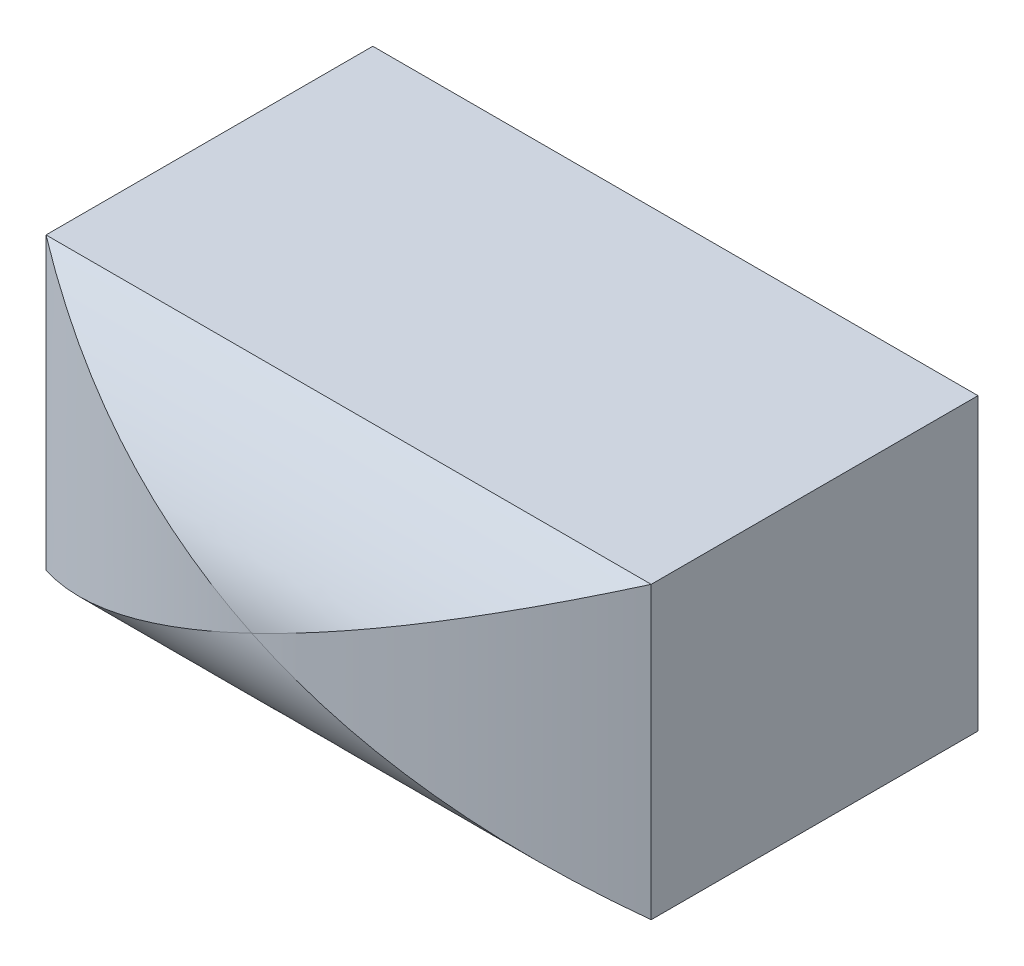
ISO-10303-21;
HEADER;
FILE_DESCRIPTION(('STEP AP214'),'2;1');
FILE_NAME('part.step','',(''),(''),'','','');
FILE_SCHEMA(('AUTOMOTIVE_DESIGN { 1 0 10303 214 1 1 1 1 }'));
ENDSEC;
DATA;
#1=APPLICATION_CONTEXT('core data for automotive mechanical design processes');
#2=APPLICATION_PROTOCOL_DEFINITION('international standard','automotive_design',2000,#1);
#3=PRODUCT_CONTEXT('',#1,'mechanical');
#4=PRODUCT('Part','Part','',(#3));
#5=PRODUCT_RELATED_PRODUCT_CATEGORY('part','',(#4));
#6=PRODUCT_DEFINITION_FORMATION('','',#4);
#7=PRODUCT_DEFINITION_CONTEXT('part definition',#1,'design');
#8=PRODUCT_DEFINITION('design','',#6,#7);
#9=PRODUCT_DEFINITION_SHAPE('','',#8);
#10=(LENGTH_UNIT() NAMED_UNIT(*) SI_UNIT(.MILLI.,.METRE.));
#11=(NAMED_UNIT(*) PLANE_ANGLE_UNIT() SI_UNIT($,.RADIAN.));
#12=(NAMED_UNIT(*) SI_UNIT($,.STERADIAN.) SOLID_ANGLE_UNIT());
#13=UNCERTAINTY_MEASURE_WITH_UNIT(LENGTH_MEASURE(1.E-05),#10,'distance_accuracy_value','');
#14=(GEOMETRIC_REPRESENTATION_CONTEXT(3) GLOBAL_UNCERTAINTY_ASSIGNED_CONTEXT((#13)) GLOBAL_UNIT_ASSIGNED_CONTEXT((#10,
#11,#12)) REPRESENTATION_CONTEXT('',''));
#15=CARTESIAN_POINT('',(0.,0.,0.));
#16=DIRECTION('',(0.,0.,1.));
#17=DIRECTION('',(1.,0.,0.));
#18=AXIS2_PLACEMENT_3D('',#15,#16,#17);
#19=CARTESIAN_POINT('',(-2500.,-1200.,3500.));
#20=DIRECTION('',(1.,0.,0.));
#21=DIRECTION('',(0.,0.,-1.));
#22=AXIS2_PLACEMENT_3D('',#19,#20,#21);
#23=PLANE('',#22);
#24=DIRECTION('',(0.,0.,-1.));
#25=VECTOR('',#24,1.);
#26=CARTESIAN_POINT('',(-2500.,250.,1000.));
#27=LINE('',#26,#25);
#28=CARTESIAN_POINT('',(-2500.,250.,1000.));
#29=VERTEX_POINT('',#28);
#30=CARTESIAN_POINT('',(-2500.,250.,0.));
#31=VERTEX_POINT('',#30);
#32=EDGE_CURVE('E108',#29,#31,#27,.T.);
#33=ORIENTED_EDGE('',*,*,#32,.F.);
#34=DIRECTION('',(0.,1.,0.));
#35=VECTOR('',#34,1.);
#36=CARTESIAN_POINT('',(-2500.,-250.,1000.));
#37=LINE('',#36,#35);
#38=CARTESIAN_POINT('',(-2500.,-250.,1000.));
#39=VERTEX_POINT('',#38);
#40=EDGE_CURVE('E297',#39,#29,#37,.T.);
#41=ORIENTED_EDGE('',*,*,#40,.F.);
#42=DIRECTION('',(0.,0.,1.));
#43=VECTOR('',#42,1.);
#44=CARTESIAN_POINT('',(-2500.,-250.,1000.));
#45=LINE('',#44,#43);
#46=CARTESIAN_POINT('',(-2500.,-250.,0.));
#47=VERTEX_POINT('',#46);
#48=EDGE_CURVE('E114',#47,#39,#45,.T.);
#49=ORIENTED_EDGE('',*,*,#48,.F.);
#50=DIRECTION('',(0.,-1.,0.));
#51=VECTOR('',#50,1.);
#52=CARTESIAN_POINT('',(-2500.,-1200.,0.));
#53=LINE('',#52,#51);
#54=CARTESIAN_POINT('',(-2500.,-1200.,0.));
#55=VERTEX_POINT('',#54);
#56=EDGE_CURVE('E183',#47,#55,#53,.T.);
#57=ORIENTED_EDGE('',*,*,#56,.T.);
#58=DIRECTION('',(0.,0.,-1.));
#59=VECTOR('',#58,1.);
#60=CARTESIAN_POINT('',(-2500.,-1200.,3500.));
#61=LINE('',#60,#59);
#62=CARTESIAN_POINT('',(-2500.,-1200.,2700.06844996732));
#63=VERTEX_POINT('',#62);
#64=EDGE_CURVE('E255',#63,#55,#61,.T.);
#65=ORIENTED_EDGE('',*,*,#64,.F.);
#66=DIRECTION('',(0.,-1.,0.));
#67=VECTOR('',#66,1.);
#68=CARTESIAN_POINT('',(-2500.,1200.,2700.06844996732));
#69=LINE('',#68,#67);
#70=CARTESIAN_POINT('',(-2500.,1200.,2700.06844996732));
#71=VERTEX_POINT('',#70);
#72=EDGE_CURVE('E236',#71,#63,#69,.T.);
#73=ORIENTED_EDGE('',*,*,#72,.F.);
#74=DIRECTION('',(0.,0.,-1.));
#75=VECTOR('',#74,1.);
#76=CARTESIAN_POINT('',(-2500.,1200.,3500.));
#77=LINE('',#76,#75);
#78=CARTESIAN_POINT('',(-2500.,1200.,0.));
#79=VERTEX_POINT('',#78);
#80=EDGE_CURVE('E258',#71,#79,#77,.T.);
#81=ORIENTED_EDGE('',*,*,#80,.T.);
#82=EDGE_CURVE('E248',#79,#31,#53,.T.);
#83=ORIENTED_EDGE('',*,*,#82,.T.);
#84=EDGE_LOOP('',(#33,#41,#49,#57,#65,#73,#81,#83));
#85=FACE_BOUND('',#84,.T.);
#86=ADVANCED_FACE('F88',(#85),#23,.F.);
#87=CARTESIAN_POINT('',(-2500.,1200.,2700.06844996732));
#88=CARTESIAN_POINT('',(-3.71772924945279E-13,1200.,4299.93155003268));
#89=CARTESIAN_POINT('',(2500.,1200.,2700.06844996732));
#90=B_SPLINE_CURVE_WITH_KNOTS('',2,(#87,#88,#89),.UNSPECIFIED.,.F.,.F.,(3,3),(0.,1.),.UNSPECIFIED.);
#91=DIRECTION('',(0.,-1.,0.));
#92=VECTOR('',#91,1.);
#93=SURFACE_OF_LINEAR_EXTRUSION('',#90,#92);
#94=DIRECTION('',(0.,-1.,0.));
#95=VECTOR('',#94,1.);
#96=CARTESIAN_POINT('',(2500.,1200.,2700.06844996732));
#97=LINE('',#96,#95);
#98=CARTESIAN_POINT('',(2500.,1200.,2700.06844996732));
#99=VERTEX_POINT('',#98);
#100=CARTESIAN_POINT('',(2500.,-1200.,2700.06844996732));
#101=VERTEX_POINT('',#100);
#102=EDGE_CURVE('E234',#99,#101,#97,.T.);
#103=ORIENTED_EDGE('',*,*,#102,.F.);
#104=CARTESIAN_POINT('',(2500.,1200.,2700.06844996732));
#105=CARTESIAN_POINT('',(2460.56025028869,1181.06892013857,2725.30768671132));
#106=CARTESIAN_POINT('',(2420.88678196818,1162.02565534473,2750.09931608531));
#107=CARTESIAN_POINT('',(2341.02225679549,1123.69068326183,2798.77508422432));
#108=CARTESIAN_POINT('',(2300.83058889641,1104.39868267028,2822.65798906947));
#109=CARTESIAN_POINT('',(2219.94587361914,1065.57401933719,2869.45905753302));
#110=CARTESIAN_POINT('',(2179.25239898305,1046.04115151186,2892.37631335845));
#111=CARTESIAN_POINT('',(2097.38126709024,1006.74300820332,2937.18972757122));
#112=CARTESIAN_POINT('',(2056.20334185353,986.977604089702,2959.0852839902));
#113=CARTESIAN_POINT('',(1973.38123503161,947.222992815165,3001.80031362612));
#114=CARTESIAN_POINT('',(1931.73691776256,927.233720526004,3022.61946324884));
#115=CARTESIAN_POINT('',(1847.99981217357,887.039909843338,3063.12854524513));
#116=CARTESIAN_POINT('',(1805.9069921269,866.835356220999,3082.81839709572));
#117=CARTESIAN_POINT('',(1742.37862969188,836.341742252148,3111.49782621573));
#118=CARTESIAN_POINT('',(1721.10437424075,826.130099635574,3120.92902942881));
#119=CARTESIAN_POINT('',(1678.44886386835,805.655454656796,3139.48867446687));
#120=CARTESIAN_POINT('',(1657.06760992977,795.392452766282,3148.61711906656));
#121=CARTESIAN_POINT('',(1614.20509525501,774.818445722409,3166.5630736677));
#122=CARTESIAN_POINT('',(1592.7238593266,764.507452476767,3175.38065658388));
#123=CARTESIAN_POINT('',(1549.65870386971,743.836177857461,3192.70105342289));
#124=CARTESIAN_POINT('',(1528.07478534472,733.475896965464,3201.20387041469));
#125=CARTESIAN_POINT('',(1484.81298381163,712.710232229585,3217.88630450437));
#126=CARTESIAN_POINT('',(1463.13513124964,702.304862999826,3226.06601873113));
#127=CARTESIAN_POINT('',(1419.68173282415,681.447231755593,3242.0989736794));
#128=CARTESIAN_POINT('',(1397.90618789139,670.994970187867,3249.95221750393));
#129=CARTESIAN_POINT('',(1354.26683831692,650.048082392119,3265.32405276632));
#130=CARTESIAN_POINT('',(1332.40306363201,639.553470543363,3272.84274882208));
#131=CARTESIAN_POINT('',(1288.583423337,618.52004320176,3287.54237837424));
#132=CARTESIAN_POINT('',(1266.62755779,607.981227739201,3294.72331210204));
#133=CARTESIAN_POINT('',(1222.63281204695,586.863749782535,3308.73991937875));
#134=CARTESIAN_POINT('',(1200.59395576911,576.285098769174,3315.57568527774));
#135=CARTESIAN_POINT('',(1156.43076907425,555.086769155643,3328.89854155923));
#136=CARTESIAN_POINT('',(1134.30643876904,544.46709060914,3335.38563239765));
#137=CARTESIAN_POINT('',(1089.97938953131,523.190106975028,3348.00482326991));
#138=CARTESIAN_POINT('',(1067.77668369325,512.532808172756,3354.13697987792));
#139=CARTESIAN_POINT('',(1023.29341061654,491.180837095936,3366.04221941037));
#140=CARTESIAN_POINT('',(1001.01284411046,480.48616517302,3371.81530570362));
#141=CARTESIAN_POINT('',(951.930107543995,456.926451621117,3384.11172994406));
#142=CARTESIAN_POINT('',(925.111664023731,444.053598731391,3390.55532339261));
#143=CARTESIAN_POINT('',(871.375387145461,418.260185829821,3402.91094325247));
#144=CARTESIAN_POINT('',(844.457553521576,405.339625690354,3408.8229682407));
#145=CARTESIAN_POINT('',(790.529999413454,379.454399718457,3420.10787502137));
#146=CARTESIAN_POINT('',(763.520278447679,366.489733654888,3425.48075398388));
#147=CARTESIAN_POINT('',(709.41662774717,340.51998131864,3435.68036613226));
#148=CARTESIAN_POINT('',(682.32269649506,327.514894317621,3440.50708941769));
#149=CARTESIAN_POINT('',(628.058375304537,301.468020146186,3449.6080059964));
#150=CARTESIAN_POINT('',(600.887982332276,288.426231519523,3453.88217704045));
#151=CARTESIAN_POINT('',(546.478587624964,262.309722059943,3461.87222890203));
#152=CARTESIAN_POINT('',(519.239581187722,249.234998969974,3465.58807033613));
#153=CARTESIAN_POINT('',(464.771565099833,223.090351248051,3472.44744433985));
#154=CARTESIAN_POINT('',(437.542698614802,210.020495335591,3475.59237526991));
#155=CARTESIAN_POINT('',(383.035812121849,183.857189818,3481.31697008191));
#156=CARTESIAN_POINT('',(355.75779056319,170.763739468516,3483.89661580404));
#157=CARTESIAN_POINT('',(301.164021414362,144.558730280702,3488.48678625096));
#158=CARTESIAN_POINT('',(273.848275482646,131.447172238429,3490.49733524149));
#159=CARTESIAN_POINT('',(219.190490841487,105.211435597149,3493.94641349789));
#160=CARTESIAN_POINT('',(191.848455432257,92.0872585822475,3495.38500702994));
#161=CARTESIAN_POINT('',(137.14973854871,65.8318745285988,3497.68823774718));
#162=CARTESIAN_POINT('',(109.79306057137,52.7006691683851,3498.55297760723));
#163=CARTESIAN_POINT('',(55.0761508846909,26.4365523305491,3499.70753240327));
#164=CARTESIAN_POINT('',(27.7159216754912,13.3036420530728,3499.99748771625));
#165=CARTESIAN_POINT('',(0.237582337864713,0.114039519131285,3499.99999458252));
#166=CARTESIAN_POINT('',(0.118791162275537,0.0570197563648097,3500.00000000082));
#167=CARTESIAN_POINT('',(0.,3.24019257594222E-13,3500.));
#168=B_SPLINE_CURVE_WITH_KNOTS('',3,(#104,#105,#106,#107,#108,#109,#110,#111,#112,#113,#114,
#115,#116,#117,#118,#119,#120,#121,#122,#123,#124,#125,#126,#127,#128,#129,#130,#131,#132,#133,
#134,#135,#136,#137,#138,#139,#140,#141,#142,#143,#144,#145,#146,#147,#148,#149,#150,#151,#152,
#153,#154,#155,#156,#157,#158,#159,#160,#161,#162,#163,#164,#165,#166,#167),.UNSPECIFIED.,.F.,
.F.,(4,2,2,2,2,2,2,2,2,2,2,2,2,2,2,2,2,2,2,2,2,2,2,2,2,2,2,2,2,2,2,4),(0.,151.517921385246,
303.234730449714,455.091121465279,607.035882323024,759.026059020843,911.027059724356,
987.264269507333,1063.50078039757,1139.71928888381,1215.93705404231,1292.13173002248,
1368.32568162451,1444.49563637735,1520.66553894433,1596.81495298496,1672.96426745079,
1749.10141060187,1825.23783932245,1916.54628641814,2007.8549779507,2099.16414872902,
2190.47497444887,2281.78947577255,2373.1104152154,2464.20456737941,2555.30164551973,
2646.39483878044,2737.47779371199,2828.54444753157,2919.58885781907,2919.98415943877),.UNSPECIFIED.);
#169=CARTESIAN_POINT('',(4.44089209850063E-13,-1.19149135002772E-09,3500.));
#170=VERTEX_POINT('',#169);
#171=EDGE_CURVE('E12',#99,#170,#168,.T.);
#172=ORIENTED_EDGE('',*,*,#171,.T.);
#173=CARTESIAN_POINT('',(2500.,-1200.,2700.06844996732));
#174=CARTESIAN_POINT('',(2460.56025028871,-1181.06892013858,2725.30768671131));
#175=CARTESIAN_POINT('',(2420.8867819682,-1162.02565534474,2750.0993160853));
#176=CARTESIAN_POINT('',(2341.02225679553,-1123.69068326185,2798.7750842243));
#177=CARTESIAN_POINT('',(2300.83058889647,-1104.3986826703,2822.65798906944));
#178=CARTESIAN_POINT('',(2219.94587361922,-1065.57401933722,2869.45905753297));
#179=CARTESIAN_POINT('',(2179.25239898313,-1046.0411515119,2892.37631335841));
#180=CARTESIAN_POINT('',(2097.38126709035,-1006.74300820337,2937.18972757117));
#181=CARTESIAN_POINT('',(2056.20334185365,-986.977604089756,2959.08528399014));
#182=CARTESIAN_POINT('',(1973.38123503174,-947.222992815228,3001.80031362606));
#183=CARTESIAN_POINT('',(1931.7369177627,-927.233720526072,3022.61946324877));
#184=CARTESIAN_POINT('',(1847.99981217374,-887.039909843416,3063.12854524505));
#185=CARTESIAN_POINT('',(1805.90699212707,-866.835356221081,3082.81839709564));
#186=CARTESIAN_POINT('',(1742.37862969205,-836.341742252233,3111.49782621565));
#187=CARTESIAN_POINT('',(1721.10437424092,-826.130099635657,3120.92902942874));
#188=CARTESIAN_POINT('',(1678.44886386851,-805.655454656874,3139.4886744668));
#189=CARTESIAN_POINT('',(1657.06760992992,-795.392452766358,3148.61711906649));
#190=CARTESIAN_POINT('',(1614.20509525516,-774.818445722479,3166.56307366764));
#191=CARTESIAN_POINT('',(1592.72385932674,-764.507452476834,3175.38065658383));
#192=CARTESIAN_POINT('',(1549.65870386984,-743.836177857522,3192.70105342284));
#193=CARTESIAN_POINT('',(1528.07478534484,-733.475896965523,3201.20387041464));
#194=CARTESIAN_POINT('',(1484.81298381175,-712.71023222964,3217.88630450433));
#195=CARTESIAN_POINT('',(1463.13513124975,-702.304862999878,3226.06601873109));
#196=CARTESIAN_POINT('',(1419.68173282425,-681.44723175564,3242.09897367936));
#197=CARTESIAN_POINT('',(1397.90618789148,-670.994970187912,3249.95221750389));
#198=CARTESIAN_POINT('',(1354.266838317,-650.048082392159,3265.32405276629));
#199=CARTESIAN_POINT('',(1332.40306363209,-639.553470543401,3272.84274882205));
#200=CARTESIAN_POINT('',(1288.58342333707,-618.520043201792,3287.54237837422));
#201=CARTESIAN_POINT('',(1266.62755779007,-607.981227739232,3294.72331210202));
#202=CARTESIAN_POINT('',(1222.632812047,-586.86374978256,3308.73991937873));
#203=CARTESIAN_POINT('',(1200.59395576916,-576.285098769195,3315.57568527773));
#204=CARTESIAN_POINT('',(1156.43076907429,-555.08676915566,3328.89854155922));
#205=CARTESIAN_POINT('',(1134.30643876908,-544.467090609156,3335.38563239765));
#206=CARTESIAN_POINT('',(1089.97938953134,-523.190106975041,3348.0048232699));
#207=CARTESIAN_POINT('',(1067.77668369326,-512.532808172766,3354.13697987791));
#208=CARTESIAN_POINT('',(1023.29341061655,-491.180837095941,3366.04221941036));
#209=CARTESIAN_POINT('',(1001.01284411046,-480.486165173022,3371.81530570362));
#210=CARTESIAN_POINT('',(951.930107543993,-456.926451621117,3384.11172994406));
#211=CARTESIAN_POINT('',(925.111664023729,-444.05359873139,3390.55532339261));
#212=CARTESIAN_POINT('',(871.375387145457,-418.260185829819,3402.91094325247));
#213=CARTESIAN_POINT('',(844.457553521572,-405.339625690352,3408.8229682407));
#214=CARTESIAN_POINT('',(790.529999413448,-379.454399718454,3420.10787502137));
#215=CARTESIAN_POINT('',(763.520278447672,-366.489733654883,3425.48075398388));
#216=CARTESIAN_POINT('',(709.416627747161,-340.519981318634,3435.68036613226));
#217=CARTESIAN_POINT('',(682.32269649505,-327.514894317614,3440.50708941769));
#218=CARTESIAN_POINT('',(628.058375304523,-301.46802014618,3449.6080059964));
#219=CARTESIAN_POINT('',(600.887982332259,-288.426231519519,3453.88217704045));
#220=CARTESIAN_POINT('',(546.478587624943,-262.309722059936,3461.87222890204));
#221=CARTESIAN_POINT('',(519.2395811877,-249.234998969962,3465.58807033613));
#222=CARTESIAN_POINT('',(464.771565099809,-223.09035124804,3472.44744433986));
#223=CARTESIAN_POINT('',(437.542698614776,-210.020495335586,3475.59237526991));
#224=CARTESIAN_POINT('',(383.03581212183,-183.857189817984,3481.31697008191));
#225=CARTESIAN_POINT('',(355.757790563181,-170.763739468483,3483.89661580404));
#226=CARTESIAN_POINT('',(301.164021414333,-144.558730280714,3488.48678625096));
#227=CARTESIAN_POINT('',(273.848275482588,-131.447172238504,3490.49733524149));
#228=CARTESIAN_POINT('',(219.19049084151,-105.211435597059,3493.94641349789));
#229=CARTESIAN_POINT('',(191.848455432392,-92.0872585819306,3495.38500702994));
#230=CARTESIAN_POINT('',(137.14973854855,-65.8318745289029,3497.68823774717));
#231=CARTESIAN_POINT('',(109.793060570805,-52.7006691695376,3498.55297760722));
#232=CARTESIAN_POINT('',(55.0761508852405,-26.4365523293924,3499.70753240328));
#233=CARTESIAN_POINT('',(27.7159216775591,-13.3036420487598,3499.99748771629));
#234=CARTESIAN_POINT('',(0.237582337883598,-0.114039519093477,3499.99999458252));
#235=CARTESIAN_POINT('',(0.118791162285263,-0.0570197563455116,3500.00000000082));
#236=CARTESIAN_POINT('',(4.9960036108132E-13,3.24019257594222E-13,3500.));
#237=B_SPLINE_CURVE_WITH_KNOTS('',3,(#173,#174,#175,#176,#177,#178,#179,#180,#181,#182,#183,
#184,#185,#186,#187,#188,#189,#190,#191,#192,#193,#194,#195,#196,#197,#198,#199,#200,#201,#202,
#203,#204,#205,#206,#207,#208,#209,#210,#211,#212,#213,#214,#215,#216,#217,#218,#219,#220,#221,
#222,#223,#224,#225,#226,#227,#228,#229,#230,#231,#232,#233,#234,#235,#236),.UNSPECIFIED.,.F.,
.F.,(4,2,2,2,2,2,2,2,2,2,2,2,2,2,2,2,2,2,2,2,2,2,2,2,2,2,2,2,2,2,2,4),(0.,151.517921385205,
303.234730449634,455.091121465163,607.035882322873,759.026059020659,911.027059724139,
987.264269507136,1063.50078039739,1139.71928888365,1215.93705404217,1292.13173002236,
1368.3256816244,1444.49563637727,1520.66553894426,1596.81495298491,1672.96426745075,
1749.10141060185,1825.23783932245,1916.54628641815,2007.8549779507,2099.16414872903,
2190.47497444889,2281.78947577257,2373.11041521543,2464.20456737943,2555.30164551976,
2646.39483878046,2737.477793712,2828.54444753158,2919.58885781907,2919.98415943877),.UNSPECIFIED.);
#238=EDGE_CURVE('E261',#170,#101,#237,.F.);
#239=ORIENTED_EDGE('',*,*,#238,.T.);
#240=EDGE_LOOP('',(#103,#172,#239));
#241=FACE_BOUND('',#240,.T.);
#242=ADVANCED_FACE('F225',(#241),#93,.F.);
#243=CARTESIAN_POINT('',(2500.,-1200.,3500.));
#244=DIRECTION('',(-1.,0.,0.));
#245=DIRECTION('',(0.,0.,1.));
#246=AXIS2_PLACEMENT_3D('',#243,#244,#245);
#247=PLANE('',#246);
#248=DIRECTION('',(0.,0.,-1.));
#249=VECTOR('',#248,1.);
#250=CARTESIAN_POINT('',(2500.,1200.,3500.));
#251=LINE('',#250,#249);
#252=CARTESIAN_POINT('',(2500.,1200.,0.));
#253=VERTEX_POINT('',#252);
#254=EDGE_CURVE('E260',#99,#253,#251,.T.);
#255=ORIENTED_EDGE('',*,*,#254,.F.);
#256=ORIENTED_EDGE('',*,*,#102,.T.);
#257=DIRECTION('',(0.,0.,-1.));
#258=VECTOR('',#257,1.);
#259=CARTESIAN_POINT('',(2500.,-1200.,3500.));
#260=LINE('',#259,#258);
#261=CARTESIAN_POINT('',(2500.,-1200.,0.));
#262=VERTEX_POINT('',#261);
#263=EDGE_CURVE('E253',#101,#262,#260,.T.);
#264=ORIENTED_EDGE('',*,*,#263,.T.);
#265=DIRECTION('',(0.,1.,0.));
#266=VECTOR('',#265,1.);
#267=CARTESIAN_POINT('',(2500.,-1200.,0.));
#268=LINE('',#267,#266);
#269=EDGE_CURVE('E242',#262,#253,#268,.T.);
#270=ORIENTED_EDGE('',*,*,#269,.T.);
#271=EDGE_LOOP('',(#255,#256,#264,#270));
#272=FACE_BOUND('',#271,.T.);
#273=ADVANCED_FACE('F90',(#272),#247,.F.);
#274=CARTESIAN_POINT('',(-2500.,1200.,3500.));
#275=DIRECTION('',(0.,-1.,0.));
#276=DIRECTION('',(0.,0.,-1.));
#277=AXIS2_PLACEMENT_3D('',#274,#275,#276);
#278=PLANE('',#277);
#279=ORIENTED_EDGE('',*,*,#80,.F.);
#280=DIRECTION('',(-1.,0.,0.));
#281=VECTOR('',#280,1.);
#282=CARTESIAN_POINT('',(2500.,1200.,2700.06844996732));
#283=LINE('',#282,#281);
#284=EDGE_CURVE('E184',#99,#71,#283,.T.);
#285=ORIENTED_EDGE('',*,*,#284,.F.);
#286=ORIENTED_EDGE('',*,*,#254,.T.);
#287=DIRECTION('',(-1.,0.,0.));
#288=VECTOR('',#287,1.);
#289=CARTESIAN_POINT('',(-2500.,1200.,0.));
#290=LINE('',#289,#288);
#291=EDGE_CURVE('E245',#253,#79,#290,.T.);
#292=ORIENTED_EDGE('',*,*,#291,.T.);
#293=EDGE_LOOP('',(#279,#285,#286,#292));
#294=FACE_BOUND('',#293,.T.);
#295=ADVANCED_FACE('F289',(#294),#278,.F.);
#296=CARTESIAN_POINT('',(-2500.,-1200.,3500.));
#297=DIRECTION('',(0.,1.,0.));
#298=DIRECTION('',(0.,0.,1.));
#299=AXIS2_PLACEMENT_3D('',#296,#297,#298);
#300=PLANE('',#299);
#301=ORIENTED_EDGE('',*,*,#263,.F.);
#302=DIRECTION('',(-1.,0.,0.));
#303=VECTOR('',#302,1.);
#304=CARTESIAN_POINT('',(2500.,-1200.,2700.06844996732));
#305=LINE('',#304,#303);
#306=EDGE_CURVE('E186',#101,#63,#305,.T.);
#307=ORIENTED_EDGE('',*,*,#306,.T.);
#308=ORIENTED_EDGE('',*,*,#64,.T.);
#309=DIRECTION('',(1.,0.,0.));
#310=VECTOR('',#309,1.);
#311=CARTESIAN_POINT('',(-2500.,-1200.,0.));
#312=LINE('',#311,#310);
#313=EDGE_CURVE('E250',#55,#262,#312,.T.);
#314=ORIENTED_EDGE('',*,*,#313,.T.);
#315=EDGE_LOOP('',(#301,#307,#308,#314));
#316=FACE_BOUND('',#315,.T.);
#317=ADVANCED_FACE('F277',(#316),#300,.F.);
#318=CARTESIAN_POINT('',(0.,0.,0.));
#319=DIRECTION('',(0.,0.,-1.));
#320=DIRECTION('',(-1.,0.,0.));
#321=AXIS2_PLACEMENT_3D('',#318,#319,#320);
#322=PLANE('',#321);
#323=ORIENTED_EDGE('',*,*,#269,.F.);
#324=ORIENTED_EDGE('',*,*,#313,.F.);
#325=ORIENTED_EDGE('',*,*,#56,.F.);
#326=DIRECTION('',(1.,0.,0.));
#327=VECTOR('',#326,1.);
#328=CARTESIAN_POINT('',(-3000.,-250.,0.));
#329=LINE('',#328,#327);
#330=CARTESIAN_POINT('',(-3000.,-250.,0.));
#331=VERTEX_POINT('',#330);
#332=EDGE_CURVE('E164',#331,#47,#329,.T.);
#333=ORIENTED_EDGE('',*,*,#332,.F.);
#334=DIRECTION('',(0.,-1.,0.));
#335=VECTOR('',#334,1.);
#336=CARTESIAN_POINT('',(-3000.,-250.,0.));
#337=LINE('',#336,#335);
#338=CARTESIAN_POINT('',(-3000.,250.,0.));
#339=VERTEX_POINT('',#338);
#340=EDGE_CURVE('E170',#339,#331,#337,.T.);
#341=ORIENTED_EDGE('',*,*,#340,.F.);
#342=DIRECTION('',(1.,0.,0.));
#343=VECTOR('',#342,1.);
#344=CARTESIAN_POINT('',(-3000.,250.,0.));
#345=LINE('',#344,#343);
#346=EDGE_CURVE('E295',#339,#31,#345,.T.);
#347=ORIENTED_EDGE('',*,*,#346,.T.);
#348=ORIENTED_EDGE('',*,*,#82,.F.);
#349=ORIENTED_EDGE('',*,*,#291,.F.);
#350=EDGE_LOOP('',(#323,#324,#325,#333,#341,#347,#348,#349));
#351=FACE_BOUND('',#350,.T.);
#352=ADVANCED_FACE('F181',(#351),#322,.T.);
#353=CARTESIAN_POINT('',(-2500.,-1200.,2700.06844996732));
#354=CARTESIAN_POINT('',(-2460.56025028871,-1181.06892013858,2725.30768671131));
#355=CARTESIAN_POINT('',(-2420.88678196821,-1162.02565534474,2750.0993160853));
#356=CARTESIAN_POINT('',(-2341.02225679553,-1123.69068326185,2798.7750842243));
#357=CARTESIAN_POINT('',(-2300.83058889647,-1104.3986826703,2822.65798906944));
#358=CARTESIAN_POINT('',(-2219.94587361922,-1065.57401933722,2869.45905753297));
#359=CARTESIAN_POINT('',(-2179.25239898313,-1046.0411515119,2892.37631335841));
#360=CARTESIAN_POINT('',(-2097.38126709035,-1006.74300820337,2937.18972757117));
#361=CARTESIAN_POINT('',(-2056.20334185365,-986.977604089757,2959.08528399014));
#362=CARTESIAN_POINT('',(-1973.38123503174,-947.222992815229,3001.80031362606));
#363=CARTESIAN_POINT('',(-1931.7369177627,-927.233720526072,3022.61946324877));
#364=CARTESIAN_POINT('',(-1847.99981217374,-887.039909843416,3063.12854524505));
#365=CARTESIAN_POINT('',(-1805.90699212707,-866.835356221082,3082.81839709564));
#366=CARTESIAN_POINT('',(-1742.37862969205,-836.341742252234,3111.49782621565));
#367=CARTESIAN_POINT('',(-1721.10437424093,-826.130099635658,3120.92902942874));
#368=CARTESIAN_POINT('',(-1678.44886386852,-805.655454656874,3139.4886744668));
#369=CARTESIAN_POINT('',(-1657.06760992992,-795.392452766358,3148.61711906649));
#370=CARTESIAN_POINT('',(-1614.20509525516,-774.81844572248,3166.56307366764));
#371=CARTESIAN_POINT('',(-1592.72385932674,-764.507452476836,3175.38065658383));
#372=CARTESIAN_POINT('',(-1549.65870386984,-743.836177857524,3192.70105342284));
#373=CARTESIAN_POINT('',(-1528.07478534484,-733.475896965523,3201.20387041464));
#374=CARTESIAN_POINT('',(-1484.81298381175,-712.710232229639,3217.88630450433));
#375=CARTESIAN_POINT('',(-1463.13513124975,-702.304862999878,3226.06601873109));
#376=CARTESIAN_POINT('',(-1419.68173282425,-681.44723175564,3242.09897367936));
#377=CARTESIAN_POINT('',(-1397.90618789148,-670.994970187912,3249.95221750389));
#378=CARTESIAN_POINT('',(-1354.266838317,-650.04808239216,3265.32405276629));
#379=CARTESIAN_POINT('',(-1332.40306363209,-639.553470543401,3272.84274882205));
#380=CARTESIAN_POINT('',(-1288.58342333707,-618.520043201792,3287.54237837422));
#381=CARTESIAN_POINT('',(-1266.62755779007,-607.981227739231,3294.72331210202));
#382=CARTESIAN_POINT('',(-1222.632812047,-586.86374978256,3308.73991937873));
#383=CARTESIAN_POINT('',(-1200.59395576916,-576.285098769197,3315.57568527773));
#384=CARTESIAN_POINT('',(-1156.43076907429,-555.086769155662,3328.89854155922));
#385=CARTESIAN_POINT('',(-1134.30643876908,-544.467090609156,3335.38563239764));
#386=CARTESIAN_POINT('',(-1089.97938953134,-523.190106975041,3348.0048232699));
#387=CARTESIAN_POINT('',(-1067.77668369326,-512.532808172767,3354.13697987791));
#388=CARTESIAN_POINT('',(-1023.29341061655,-491.180837095942,3366.04221941036));
#389=CARTESIAN_POINT('',(-1001.01284411046,-480.486165173023,3371.81530570362));
#390=CARTESIAN_POINT('',(-951.930107543994,-456.926451621116,3384.11172994406));
#391=CARTESIAN_POINT('',(-925.11166402373,-444.053598731389,3390.55532339261));
#392=CARTESIAN_POINT('',(-871.375387145459,-418.260185829818,3402.91094325247));
#393=CARTESIAN_POINT('',(-844.457553521572,-405.339625690352,3408.8229682407));
#394=CARTESIAN_POINT('',(-790.529999413448,-379.454399718454,3420.10787502137));
#395=CARTESIAN_POINT('',(-763.520278447673,-366.489733654882,3425.48075398388));
#396=CARTESIAN_POINT('',(-709.41662774716,-340.519981318637,3435.68036613226));
#397=CARTESIAN_POINT('',(-682.322696495046,-327.514894317622,3440.50708941769));
#398=CARTESIAN_POINT('',(-628.058375304525,-301.468020146174,3449.6080059964));
#399=CARTESIAN_POINT('',(-600.887982332271,-288.426231519493,3453.88217704045));
#400=CARTESIAN_POINT('',(-546.478587624929,-262.309722059965,3461.87222890204));
#401=CARTESIAN_POINT('',(-519.23958118765,-249.234998970065,3465.58807033613));
#402=CARTESIAN_POINT('',(-464.771565099857,-223.090351247937,3472.44744433986));
#403=CARTESIAN_POINT('',(-437.542698614959,-210.020495335204,3475.59237526991));
#404=CARTESIAN_POINT('',(-383.035812121649,-183.85718981836,3481.31697008191));
#405=CARTESIAN_POINT('',(-355.757790562502,-170.763739469896,3483.89661580404));
#406=CARTESIAN_POINT('',(-301.164021415008,-144.558730279307,3488.48678625096));
#407=CARTESIAN_POINT('',(-273.848275485114,-131.447172233239,3490.49733524149));
#408=CARTESIAN_POINT('',(-219.19049083898,-105.211435602328,3493.94641349789));
#409=CARTESIAN_POINT('',(-191.848455422955,-92.0872586015879,3495.38500702994));
#410=CARTESIAN_POINT('',(-137.149738557979,-65.8318745092579,3497.68823774717));
#411=CARTESIAN_POINT('',(-109.793060606,-52.7006690962133,3498.55297760722));
#412=CARTESIAN_POINT('',(-55.0761508500532,-26.4365524026961,3499.70753240328));
#413=CARTESIAN_POINT('',(-27.7159215462541,-13.3036423223087,3499.99748771629));
#414=CARTESIAN_POINT('',(-0.237582336744058,-0.114039521464617,3499.99999458252));
#415=CARTESIAN_POINT('',(-0.118791161712854,-0.0570197575355385,3500.00000000082));
#416=CARTESIAN_POINT('',(4.9960036108132E-13,3.24019257594222E-13,3500.));
#417=B_SPLINE_CURVE_WITH_KNOTS('',3,(#353,#354,#355,#356,#357,#358,#359,#360,#361,#362,#363,
#364,#365,#366,#367,#368,#369,#370,#371,#372,#373,#374,#375,#376,#377,#378,#379,#380,#381,#382,
#383,#384,#385,#386,#387,#388,#389,#390,#391,#392,#393,#394,#395,#396,#397,#398,#399,#400,#401,
#402,#403,#404,#405,#406,#407,#408,#409,#410,#411,#412,#413,#414,#415,#416),.UNSPECIFIED.,.F.,
.F.,(4,2,2,2,2,2,2,2,2,2,2,2,2,2,2,2,2,2,2,2,2,2,2,2,2,2,2,2,2,2,2,4),(0.,151.517921385204,
303.234730449634,455.091121465163,607.035882322873,759.026059020658,911.027059724138,
987.264269507135,1063.50078039739,1139.71928888365,1215.93705404217,1292.13173002236,
1368.3256816244,1444.49563637727,1520.66553894426,1596.81495298491,1672.96426745075,
1749.10141060185,1825.23783932245,1916.54628641815,2007.8549779507,2099.16414872903,
2190.47497444889,2281.78947577257,2373.11041521543,2464.20456737944,2555.30164551976,
2646.39483878046,2737.477793712,2828.54444753158,2919.58885781907,2919.98415943878),.UNSPECIFIED.);
#418=EDGE_CURVE('E214',#63,#170,#417,.T.);
#419=ORIENTED_EDGE('',*,*,#418,.T.);
#420=CARTESIAN_POINT('',(-2500.,1200.,2700.06844996732));
#421=CARTESIAN_POINT('',(-2460.56025028868,1181.06892013857,2725.30768671133));
#422=CARTESIAN_POINT('',(-2420.88678196816,1162.02565534472,2750.09931608532));
#423=CARTESIAN_POINT('',(-2341.02225679544,1123.69068326181,2798.77508422435));
#424=CARTESIAN_POINT('',(-2300.83058889636,1104.39868267025,2822.6579890695));
#425=CARTESIAN_POINT('',(-2219.94587361907,1065.57401933715,2869.45905753306));
#426=CARTESIAN_POINT('',(-2179.25239898296,1046.04115151182,2892.3763133585));
#427=CARTESIAN_POINT('',(-2097.38126709014,1006.74300820327,2937.18972757128));
#428=CARTESIAN_POINT('',(-2056.20334185342,986.977604089647,2959.08528399026));
#429=CARTESIAN_POINT('',(-1973.38123503147,947.2229928151,3001.80031362619));
#430=CARTESIAN_POINT('',(-1931.73691776241,927.233720525934,3022.61946324891));
#431=CARTESIAN_POINT('',(-1847.99981217341,887.03990984326,3063.12854524521));
#432=CARTESIAN_POINT('',(-1805.90699212673,866.835356220919,3082.8183970958));
#433=CARTESIAN_POINT('',(-1742.3786296917,836.341742252064,3111.49782621581));
#434=CARTESIAN_POINT('',(-1721.10437424058,826.130099635492,3120.92902942889));
#435=CARTESIAN_POINT('',(-1678.44886386819,805.655454656718,3139.48867446694));
#436=CARTESIAN_POINT('',(-1657.06760992961,795.392452766208,3148.61711906662));
#437=CARTESIAN_POINT('',(-1614.20509525487,774.81844572234,3166.56307366776));
#438=CARTESIAN_POINT('',(-1592.72385932646,764.5074524767,3175.38065658394));
#439=CARTESIAN_POINT('',(-1549.65870386958,743.836177857398,3192.70105342294));
#440=CARTESIAN_POINT('',(-1528.07478534459,733.475896965402,3201.20387041474));
#441=CARTESIAN_POINT('',(-1484.81298381152,712.710232229529,3217.88630450441));
#442=CARTESIAN_POINT('',(-1463.13513124953,702.304862999773,3226.06601873117));
#443=CARTESIAN_POINT('',(-1419.68173282405,681.447231755546,3242.09897367943));
#444=CARTESIAN_POINT('',(-1397.9061878913,670.994970187821,3249.95221750396));
#445=CARTESIAN_POINT('',(-1354.26683831683,650.048082392078,3265.32405276635));
#446=CARTESIAN_POINT('',(-1332.40306363193,639.553470543325,3272.84274882211));
#447=CARTESIAN_POINT('',(-1288.58342333693,618.520043201727,3287.54237837426));
#448=CARTESIAN_POINT('',(-1266.62755778994,607.981227739171,3294.72331210206));
#449=CARTESIAN_POINT('',(-1222.6328120469,586.863749782508,3308.73991937877));
#450=CARTESIAN_POINT('',(-1200.59395576906,576.285098769149,3315.57568527776));
#451=CARTESIAN_POINT('',(-1156.43076907422,555.086769155624,3328.89854155925));
#452=CARTESIAN_POINT('',(-1134.30643876901,544.467090609125,3335.38563239766));
#453=CARTESIAN_POINT('',(-1089.97938953129,523.19010697502,3348.00482326991));
#454=CARTESIAN_POINT('',(-1067.77668369323,512.532808172749,3354.13697987792));
#455=CARTESIAN_POINT('',(-1023.29341061653,491.180837095933,3366.04221941037));
#456=CARTESIAN_POINT('',(-1001.01284411045,480.486165173018,3371.81530570362));
#457=CARTESIAN_POINT('',(-951.930107543996,456.926451621117,3384.11172994406));
#458=CARTESIAN_POINT('',(-925.111664023733,444.053598731392,3390.55532339261));
#459=CARTESIAN_POINT('',(-871.375387145465,418.260185829822,3402.91094325247));
#460=CARTESIAN_POINT('',(-844.45755352158,405.339625690357,3408.8229682407));
#461=CARTESIAN_POINT('',(-790.529999413461,379.45439971846,3420.10787502137));
#462=CARTESIAN_POINT('',(-763.520278447687,366.489733654889,3425.48075398388));
#463=CARTESIAN_POINT('',(-709.416627747179,340.519981318647,3435.68036613226));
#464=CARTESIAN_POINT('',(-682.322696495067,327.514894317635,3440.50708941769));
#465=CARTESIAN_POINT('',(-628.058375304558,301.468020146179,3449.6080059964));
#466=CARTESIAN_POINT('',(-600.887982332313,288.426231519488,3453.88217704045));
#467=CARTESIAN_POINT('',(-546.478587624961,262.309722060002,3461.87222890203));
#468=CARTESIAN_POINT('',(-519.239581187663,249.234998970156,3465.58807033613));
#469=CARTESIAN_POINT('',(-464.771565099936,223.090351247898,3472.44744433985));
#470=CARTESIAN_POINT('',(-437.542698615123,210.020495334983,3475.5923752699));
#471=CARTESIAN_POINT('',(-383.035812121575,183.857189818628,3481.31697008191));
#472=CARTESIAN_POINT('',(-355.757790562104,170.763739470835,3483.89661580404));
#473=CARTESIAN_POINT('',(-301.164021415488,144.558730278407,3488.48678625095));
#474=CARTESIAN_POINT('',(-273.848275486797,131.44717222983,3490.49733524149));
#475=CARTESIAN_POINT('',(-219.19049083737,105.211435605767,3493.94641349789));
#476=CARTESIAN_POINT('',(-191.848455416851,92.0872586143827,3495.38500702993));
#477=CARTESIAN_POINT('',(-137.149738564133,65.8318744964993,3497.68823774718));
#478=CARTESIAN_POINT('',(-109.793060628901,52.7006690485534,3498.55297760724));
#479=CARTESIAN_POINT('',(-55.0761508271987,26.4365524503388,3499.70753240326));
#480=CARTESIAN_POINT('',(-27.7159214609145,13.3036425001149,3499.99748771622));
#481=CARTESIAN_POINT('',(-0.23758233600471,0.114039523006563,3499.99999458252));
#482=CARTESIAN_POINT('',(-0.118791161342039,0.0570197583097323,3500.00000000082));
#483=CARTESIAN_POINT('',(0.,3.24019257594222E-13,3500.));
#484=B_SPLINE_CURVE_WITH_KNOTS('',3,(#420,#421,#422,#423,#424,#425,#426,#427,#428,#429,#430,
#431,#432,#433,#434,#435,#436,#437,#438,#439,#440,#441,#442,#443,#444,#445,#446,#447,#448,#449,
#450,#451,#452,#453,#454,#455,#456,#457,#458,#459,#460,#461,#462,#463,#464,#465,#466,#467,#468,
#469,#470,#471,#472,#473,#474,#475,#476,#477,#478,#479,#480,#481,#482,#483),.UNSPECIFIED.,.F.,
.F.,(4,2,2,2,2,2,2,2,2,2,2,2,2,2,2,2,2,2,2,2,2,2,2,2,2,2,2,2,2,2,2,4),(0.,151.517921385288,
303.234730449795,455.091121465397,607.035882323176,759.026059021029,911.027059724574,
987.264269507533,1063.50078039775,1139.71928888397,1215.93705404245,1292.1317300226,
1368.32568162461,1444.49563637744,1520.66553894439,1596.81495298501,1672.96426745082,
1749.10141060188,1825.23783932245,1916.54628641814,2007.85497795069,2099.16414872901,
2190.47497444886,2281.78947577253,2373.11041521537,2464.20456737938,2555.30164551971,
2646.39483878042,2737.47779371197,2828.54444753157,2919.58885781907,2919.98415943878),.UNSPECIFIED.);
#485=EDGE_CURVE('E101',#170,#71,#484,.F.);
#486=ORIENTED_EDGE('',*,*,#485,.T.);
#487=ORIENTED_EDGE('',*,*,#72,.T.);
#488=EDGE_LOOP('',(#419,#486,#487));
#489=FACE_BOUND('',#488,.T.);
#490=ADVANCED_FACE('F219',(#489),#93,.F.);
#491=CARTESIAN_POINT('',(2500.,1200.,2700.06844996732));
#492=CARTESIAN_POINT('',(2500.,0.,4299.93155003268));
#493=CARTESIAN_POINT('',(2500.,-1200.,2700.06844996732));
#494=B_SPLINE_CURVE_WITH_KNOTS('',2,(#491,#492,#493),.UNSPECIFIED.,.F.,.F.,(3,3),(0.,1.),.UNSPECIFIED.);
#495=DIRECTION('',(-1.,0.,0.));
#496=VECTOR('',#495,1.);
#497=SURFACE_OF_LINEAR_EXTRUSION('',#494,#496);
#498=ORIENTED_EDGE('',*,*,#306,.F.);
#499=ORIENTED_EDGE('',*,*,#238,.F.);
#500=ORIENTED_EDGE('',*,*,#418,.F.);
#501=EDGE_LOOP('',(#498,#499,#500));
#502=FACE_BOUND('',#501,.T.);
#503=ADVANCED_FACE('F204',(#502),#497,.F.);
#504=CARTESIAN_POINT('',(2500.,1200.,2700.06844996732));
#505=CARTESIAN_POINT('',(2500.,0.,4299.93155003268));
#506=CARTESIAN_POINT('',(2500.,-1200.,2700.06844996732));
#507=B_SPLINE_CURVE_WITH_KNOTS('',2,(#504,#505,#506),.UNSPECIFIED.,.F.,.F.,(3,3),(0.,1.),.UNSPECIFIED.);
#508=DIRECTION('',(-1.,0.,0.));
#509=VECTOR('',#508,1.);
#510=SURFACE_OF_LINEAR_EXTRUSION('',#507,#509);
#511=ORIENTED_EDGE('',*,*,#284,.T.);
#512=ORIENTED_EDGE('',*,*,#485,.F.);
#513=ORIENTED_EDGE('',*,*,#171,.F.);
#514=EDGE_LOOP('',(#511,#512,#513));
#515=FACE_BOUND('',#514,.T.);
#516=ADVANCED_FACE('F199',(#515),#510,.F.);
#517=CARTESIAN_POINT('',(-3000.,-250.,1000.));
#518=DIRECTION('',(0.,1.,0.));
#519=DIRECTION('',(0.,0.,1.));
#520=AXIS2_PLACEMENT_3D('',#517,#518,#519);
#521=PLANE('',#520);
#522=ORIENTED_EDGE('',*,*,#48,.T.);
#523=DIRECTION('',(1.,0.,0.));
#524=VECTOR('',#523,1.);
#525=CARTESIAN_POINT('',(-3000.,-250.,1000.));
#526=LINE('',#525,#524);
#527=CARTESIAN_POINT('',(-3000.,-250.,1000.));
#528=VERTEX_POINT('',#527);
#529=EDGE_CURVE('E166',#528,#39,#526,.T.);
#530=ORIENTED_EDGE('',*,*,#529,.F.);
#531=DIRECTION('',(0.,0.,1.));
#532=VECTOR('',#531,1.);
#533=CARTESIAN_POINT('',(-3000.,-250.,1000.));
#534=LINE('',#533,#532);
#535=EDGE_CURVE('E160',#331,#528,#534,.T.);
#536=ORIENTED_EDGE('',*,*,#535,.F.);
#537=ORIENTED_EDGE('',*,*,#332,.T.);
#538=EDGE_LOOP('',(#522,#530,#536,#537));
#539=FACE_BOUND('',#538,.T.);
#540=ADVANCED_FACE('F162',(#539),#521,.F.);
#541=CARTESIAN_POINT('',(-3000.,-250.,1000.));
#542=DIRECTION('',(0.,0.,-1.));
#543=DIRECTION('',(-1.,0.,0.));
#544=AXIS2_PLACEMENT_3D('',#541,#542,#543);
#545=PLANE('',#544);
#546=ORIENTED_EDGE('',*,*,#40,.T.);
#547=DIRECTION('',(1.,0.,0.));
#548=VECTOR('',#547,1.);
#549=CARTESIAN_POINT('',(-3000.,250.,1000.));
#550=LINE('',#549,#548);
#551=CARTESIAN_POINT('',(-3000.,250.,1000.));
#552=VERTEX_POINT('',#551);
#553=EDGE_CURVE('E188',#552,#29,#550,.T.);
#554=ORIENTED_EDGE('',*,*,#553,.F.);
#555=DIRECTION('',(0.,1.,0.));
#556=VECTOR('',#555,1.);
#557=CARTESIAN_POINT('',(-3000.,-250.,1000.));
#558=LINE('',#557,#556);
#559=EDGE_CURVE('E169',#528,#552,#558,.T.);
#560=ORIENTED_EDGE('',*,*,#559,.F.);
#561=ORIENTED_EDGE('',*,*,#529,.T.);
#562=EDGE_LOOP('',(#546,#554,#560,#561));
#563=FACE_BOUND('',#562,.T.);
#564=ADVANCED_FACE('F305',(#563),#545,.F.);
#565=CARTESIAN_POINT('',(-3000.,250.,1000.));
#566=DIRECTION('',(0.,-1.,0.));
#567=DIRECTION('',(0.,0.,-1.));
#568=AXIS2_PLACEMENT_3D('',#565,#566,#567);
#569=PLANE('',#568);
#570=ORIENTED_EDGE('',*,*,#32,.T.);
#571=ORIENTED_EDGE('',*,*,#346,.F.);
#572=DIRECTION('',(0.,0.,-1.));
#573=VECTOR('',#572,1.);
#574=CARTESIAN_POINT('',(-3000.,250.,1000.));
#575=LINE('',#574,#573);
#576=EDGE_CURVE('E175',#552,#339,#575,.T.);
#577=ORIENTED_EDGE('',*,*,#576,.F.);
#578=ORIENTED_EDGE('',*,*,#553,.T.);
#579=EDGE_LOOP('',(#570,#571,#577,#578));
#580=FACE_BOUND('',#579,.T.);
#581=ADVANCED_FACE('F294',(#580),#569,.F.);
#582=CARTESIAN_POINT('',(-3000.,0.,0.));
#583=DIRECTION('',(-1.,0.,0.));
#584=DIRECTION('',(0.,0.,1.));
#585=AXIS2_PLACEMENT_3D('',#582,#583,#584);
#586=PLANE('',#585);
#587=ORIENTED_EDGE('',*,*,#340,.T.);
#588=ORIENTED_EDGE('',*,*,#535,.T.);
#589=ORIENTED_EDGE('',*,*,#559,.T.);
#590=ORIENTED_EDGE('',*,*,#576,.T.);
#591=EDGE_LOOP('',(#587,#588,#589,#590));
#592=FACE_BOUND('',#591,.T.);
#593=ADVANCED_FACE('F173',(#592),#586,.T.);
#594=CLOSED_SHELL('',(#86,#242,#273,#295,#317,#352,#490,#503,#516,#540,#564,#581,#593));
#595=MANIFOLD_SOLID_BREP('B2',#594);
#596=ADVANCED_BREP_SHAPE_REPRESENTATION('',(#18,#595),#14);
#597=SHAPE_DEFINITION_REPRESENTATION(#9,#596);
ENDSEC;
END-ISO-10303-21;
